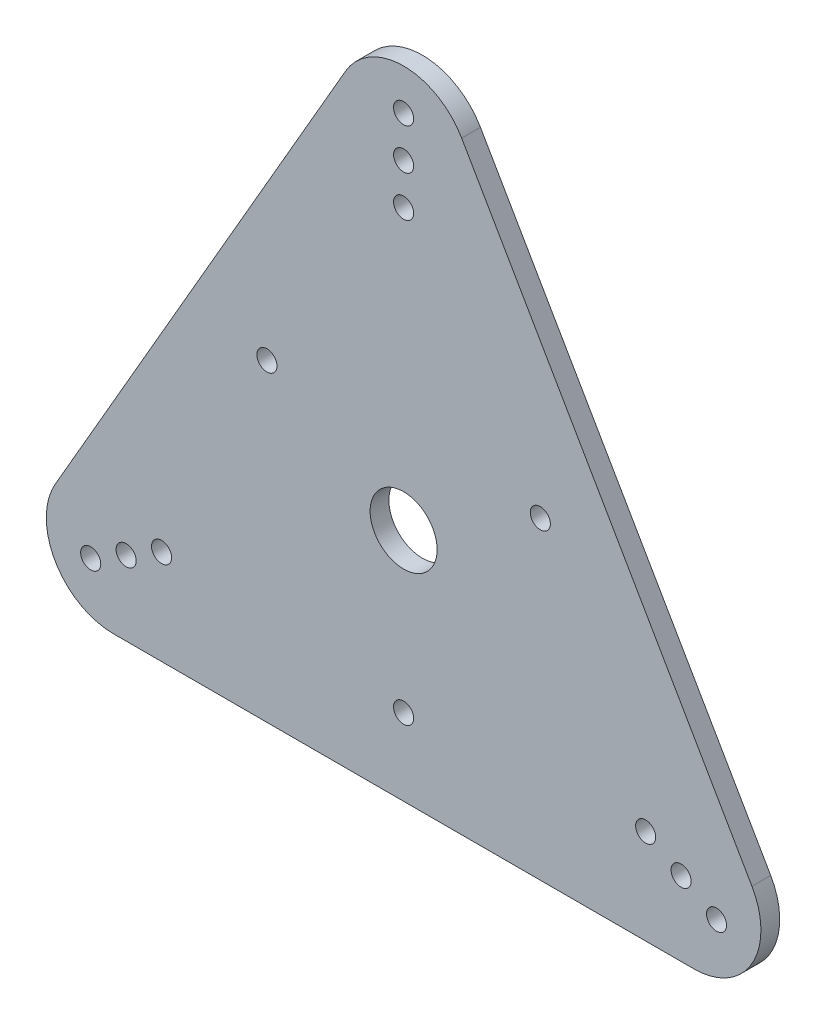
ISO-10303-21;
HEADER;
FILE_DESCRIPTION(('STEP AP214'),'2;1');
FILE_NAME('part.step','',(''),(''),'','','');
FILE_SCHEMA(('AUTOMOTIVE_DESIGN { 1 0 10303 214 1 1 1 1 }'));
ENDSEC;
DATA;
#1=APPLICATION_CONTEXT('core data for automotive mechanical design processes');
#2=APPLICATION_PROTOCOL_DEFINITION('international standard','automotive_design',2000,#1);
#3=PRODUCT_CONTEXT('',#1,'mechanical');
#4=PRODUCT('Part','Part','',(#3));
#5=PRODUCT_RELATED_PRODUCT_CATEGORY('part','',(#4));
#6=PRODUCT_DEFINITION_FORMATION('','',#4);
#7=PRODUCT_DEFINITION_CONTEXT('part definition',#1,'design');
#8=PRODUCT_DEFINITION('design','',#6,#7);
#9=PRODUCT_DEFINITION_SHAPE('','',#8);
#10=(LENGTH_UNIT() NAMED_UNIT(*) SI_UNIT(.MILLI.,.METRE.));
#11=(NAMED_UNIT(*) PLANE_ANGLE_UNIT() SI_UNIT($,.RADIAN.));
#12=(NAMED_UNIT(*) SI_UNIT($,.STERADIAN.) SOLID_ANGLE_UNIT());
#13=UNCERTAINTY_MEASURE_WITH_UNIT(LENGTH_MEASURE(1.E-05),#10,'distance_accuracy_value','');
#14=(GEOMETRIC_REPRESENTATION_CONTEXT(3) GLOBAL_UNCERTAINTY_ASSIGNED_CONTEXT((#13)) GLOBAL_UNIT_ASSIGNED_CONTEXT((#10,
#11,#12)) REPRESENTATION_CONTEXT('',''));
#15=CARTESIAN_POINT('',(0.,0.,0.));
#16=DIRECTION('',(0.,0.,1.));
#17=DIRECTION('',(1.,0.,0.));
#18=AXIS2_PLACEMENT_3D('',#15,#16,#17);
#19=CARTESIAN_POINT('',(-106.844518253204,107.347932616789,2.8));
#20=DIRECTION('',(0.,0.,1.));
#21=DIRECTION('',(1.,0.,0.));
#22=AXIS2_PLACEMENT_3D('',#19,#20,#21);
#23=PLANE('',#22);
#24=CARTESIAN_POINT('',(-27.4364839166996,111.501682616789,2.8));
#25=DIRECTION('',(0.,0.,1.));
#26=DIRECTION('',(1.,0.,0.));
#27=AXIS2_PLACEMENT_3D('',#24,#25,#26);
#28=CIRCLE('',#27,1.5);
#29=CARTESIAN_POINT('',(-25.9364839166996,111.501682616789,2.8));
#30=VERTEX_POINT('',#29);
#31=EDGE_CURVE('E228',#30,#30,#28,.T.);
#32=ORIENTED_EDGE('',*,*,#31,.F.);
#33=EDGE_LOOP('',(#32));
#34=FACE_BOUND('',#33,.T.);
#35=CARTESIAN_POINT('',(-16.8666438635105,105.399182616789,2.8));
#36=DIRECTION('',(0.,0.,1.));
#37=DIRECTION('',(1.,0.,0.));
#38=AXIS2_PLACEMENT_3D('',#35,#36,#37);
#39=CIRCLE('',#38,1.5);
#40=CARTESIAN_POINT('',(-15.3666438635105,105.399182616789,2.8));
#41=VERTEX_POINT('',#40);
#42=EDGE_CURVE('E240',#41,#41,#39,.T.);
#43=ORIENTED_EDGE('',*,*,#42,.F.);
#44=EDGE_LOOP('',(#43));
#45=FACE_BOUND('',#44,.T.);
#46=CARTESIAN_POINT('',(-104.93493223786,108.450432616789,2.8));
#47=DIRECTION('',(0.,0.,1.));
#48=DIRECTION('',(1.,0.,0.));
#49=AXIS2_PLACEMENT_3D('',#46,#47,#48);
#50=CIRCLE('',#49,1.5);
#51=CARTESIAN_POINT('',(-103.43493223786,108.450432616789,2.8));
#52=VERTEX_POINT('',#51);
#53=EDGE_CURVE('E252',#52,#52,#50,.T.);
#54=ORIENTED_EDGE('',*,*,#53,.F.);
#55=EDGE_LOOP('',(#54));
#56=FACE_BOUND('',#55,.T.);
#57=CARTESIAN_POINT('',(-63.5432480639823,174.040432616789,2.8));
#58=DIRECTION('',(0.,0.,1.));
#59=DIRECTION('',(1.,0.,0.));
#60=AXIS2_PLACEMENT_3D('',#57,#58,#59);
#61=CIRCLE('',#60,1.5);
#62=CARTESIAN_POINT('',(-62.0432480639823,174.040432616789,2.8));
#63=VERTEX_POINT('',#62);
#64=EDGE_CURVE('E264',#63,#63,#61,.T.);
#65=ORIENTED_EDGE('',*,*,#64,.F.);
#66=EDGE_LOOP('',(#65));
#67=FACE_BOUND('',#66,.T.);
#68=CARTESIAN_POINT('',(-63.5432480639823,186.245432616789,2.8));
#69=DIRECTION('',(0.,0.,1.));
#70=DIRECTION('',(1.,0.,0.));
#71=AXIS2_PLACEMENT_3D('',#68,#69,#70);
#72=CIRCLE('',#71,1.5);
#73=CARTESIAN_POINT('',(-62.0432480639823,186.245432616789,2.8));
#74=VERTEX_POINT('',#73);
#75=EDGE_CURVE('E276',#74,#74,#72,.T.);
#76=ORIENTED_EDGE('',*,*,#75,.F.);
#77=EDGE_LOOP('',(#76));
#78=FACE_BOUND('',#77,.T.);
#79=CARTESIAN_POINT('',(-43.1526799318777,144.120432616789,2.8));
#80=DIRECTION('',(0.,0.,1.));
#81=DIRECTION('',(1.,0.,0.));
#82=AXIS2_PLACEMENT_3D('',#79,#80,#81);
#83=CIRCLE('',#82,1.5);
#84=CARTESIAN_POINT('',(-41.6526799318777,144.120432616789,2.8));
#85=VERTEX_POINT('',#84);
#86=EDGE_CURVE('E288',#85,#85,#83,.T.);
#87=ORIENTED_EDGE('',*,*,#86,.F.);
#88=EDGE_LOOP('',(#87));
#89=FACE_BOUND('',#88,.T.);
#90=CARTESIAN_POINT('',(-106.844518253204,107.347932616789,2.8));
#91=DIRECTION('',(0.,0.,1.));
#92=DIRECTION('',(1.,0.,0.));
#93=AXIS2_PLACEMENT_3D('',#90,#91,#92);
#94=CIRCLE('',#93,9.99999999999999);
#95=CARTESIAN_POINT('',(-115.504772291049,112.347932616789,2.8));
#96=VERTEX_POINT('',#95);
#97=CARTESIAN_POINT('',(-106.844518253204,97.3479326167893,2.8));
#98=VERTEX_POINT('',#97);
#99=EDGE_CURVE('E132',#96,#98,#94,.T.);
#100=ORIENTED_EDGE('',*,*,#99,.T.);
#101=DIRECTION('',(1.,0.,0.));
#102=VECTOR('',#101,1.);
#103=CARTESIAN_POINT('',(-106.844518253204,97.3479326167893,2.8));
#104=LINE('',#103,#102);
#105=CARTESIAN_POINT('',(-20.2419778747603,97.3479326167892,2.8));
#106=VERTEX_POINT('',#105);
#107=EDGE_CURVE('E90',#98,#106,#104,.T.);
#108=ORIENTED_EDGE('',*,*,#107,.T.);
#109=CARTESIAN_POINT('',(-20.2419778747603,107.347932616789,2.8));
#110=DIRECTION('',(0.,0.,1.));
#111=DIRECTION('',(1.,0.,0.));
#112=AXIS2_PLACEMENT_3D('',#109,#110,#111);
#113=CIRCLE('',#112,9.99999999999999);
#114=CARTESIAN_POINT('',(-11.5817238369159,112.347932616789,2.8));
#115=VERTEX_POINT('',#114);
#116=EDGE_CURVE('E103',#106,#115,#113,.T.);
#117=ORIENTED_EDGE('',*,*,#116,.T.);
#118=DIRECTION('',(-0.5,0.866025403784439,0.));
#119=VECTOR('',#118,1.);
#120=CARTESIAN_POINT('',(-11.5817238369159,112.347932616789,2.8));
#121=LINE('',#120,#119);
#122=CARTESIAN_POINT('',(-54.8829940261379,187.347932616789,2.8));
#123=VERTEX_POINT('',#122);
#124=EDGE_CURVE('E97',#115,#123,#121,.T.);
#125=ORIENTED_EDGE('',*,*,#124,.T.);
#126=CARTESIAN_POINT('',(-63.5432480639823,182.347932616789,2.8));
#127=DIRECTION('',(0.,0.,1.));
#128=DIRECTION('',(1.,0.,0.));
#129=AXIS2_PLACEMENT_3D('',#126,#127,#128);
#130=CIRCLE('',#129,9.99999999999999);
#131=CARTESIAN_POINT('',(-72.2035021018266,187.347932616789,2.8));
#132=VERTEX_POINT('',#131);
#133=EDGE_CURVE('E101',#123,#132,#130,.T.);
#134=ORIENTED_EDGE('',*,*,#133,.T.);
#135=DIRECTION('',(-0.5,-0.866025403784439,0.));
#136=VECTOR('',#135,1.);
#137=CARTESIAN_POINT('',(-72.2035021018266,187.347932616789,2.8));
#138=LINE('',#137,#136);
#139=EDGE_CURVE('E53',#132,#96,#138,.T.);
#140=ORIENTED_EDGE('',*,*,#139,.T.);
#141=EDGE_LOOP('',(#100,#108,#117,#125,#134,#140));
#142=FACE_BOUND('',#141,.T.);
#143=CARTESIAN_POINT('',(-63.5432480639823,108.802932616789,2.8));
#144=DIRECTION('',(0.,0.,1.));
#145=DIRECTION('',(1.,0.,0.));
#146=AXIS2_PLACEMENT_3D('',#143,#144,#145);
#147=CIRCLE('',#146,1.5);
#148=CARTESIAN_POINT('',(-62.0432480639823,108.802932616789,2.8));
#149=VERTEX_POINT('',#148);
#150=EDGE_CURVE('E125',#149,#149,#147,.T.);
#151=ORIENTED_EDGE('',*,*,#150,.F.);
#152=EDGE_LOOP('',(#151));
#153=FACE_BOUND('',#152,.T.);
#154=CARTESIAN_POINT('',(-83.9338161960869,144.120432616789,2.8));
#155=DIRECTION('',(0.,0.,1.));
#156=DIRECTION('',(1.,0.,0.));
#157=AXIS2_PLACEMENT_3D('',#154,#155,#156);
#158=CIRCLE('',#157,1.5);
#159=CARTESIAN_POINT('',(-82.4338161960869,144.120432616789,2.8));
#160=VERTEX_POINT('',#159);
#161=EDGE_CURVE('E282',#160,#160,#158,.T.);
#162=ORIENTED_EDGE('',*,*,#161,.F.);
#163=EDGE_LOOP('',(#162));
#164=FACE_BOUND('',#163,.T.);
#165=CARTESIAN_POINT('',(-63.5432480639823,180.142932616789,2.8));
#166=DIRECTION('',(0.,0.,1.));
#167=DIRECTION('',(1.,0.,0.));
#168=AXIS2_PLACEMENT_3D('',#165,#166,#167);
#169=CIRCLE('',#168,1.5);
#170=CARTESIAN_POINT('',(-62.0432480639823,180.142932616789,2.8));
#171=VERTEX_POINT('',#170);
#172=EDGE_CURVE('E270',#171,#171,#169,.T.);
#173=ORIENTED_EDGE('',*,*,#172,.F.);
#174=EDGE_LOOP('',(#173));
#175=FACE_BOUND('',#174,.T.);
#176=CARTESIAN_POINT('',(-110.219852264454,105.399182616789,2.8));
#177=DIRECTION('',(0.,0.,1.));
#178=DIRECTION('',(1.,0.,0.));
#179=AXIS2_PLACEMENT_3D('',#176,#177,#178);
#180=CIRCLE('',#179,1.5);
#181=CARTESIAN_POINT('',(-108.719852264454,105.399182616789,2.8));
#182=VERTEX_POINT('',#181);
#183=EDGE_CURVE('E258',#182,#182,#180,.T.);
#184=ORIENTED_EDGE('',*,*,#183,.F.);
#185=EDGE_LOOP('',(#184));
#186=FACE_BOUND('',#185,.T.);
#187=CARTESIAN_POINT('',(-99.650012211265,111.501682616789,2.8));
#188=DIRECTION('',(0.,0.,1.));
#189=DIRECTION('',(1.,0.,0.));
#190=AXIS2_PLACEMENT_3D('',#187,#188,#189);
#191=CIRCLE('',#190,1.5);
#192=CARTESIAN_POINT('',(-98.150012211265,111.501682616789,2.8));
#193=VERTEX_POINT('',#192);
#194=EDGE_CURVE('E246',#193,#193,#191,.T.);
#195=ORIENTED_EDGE('',*,*,#194,.F.);
#196=EDGE_LOOP('',(#195));
#197=FACE_BOUND('',#196,.T.);
#198=CARTESIAN_POINT('',(-22.151563890105,108.450432616789,2.8));
#199=DIRECTION('',(0.,0.,1.));
#200=DIRECTION('',(1.,0.,0.));
#201=AXIS2_PLACEMENT_3D('',#198,#199,#200);
#202=CIRCLE('',#201,1.5);
#203=CARTESIAN_POINT('',(-20.651563890105,108.450432616789,2.8));
#204=VERTEX_POINT('',#203);
#205=EDGE_CURVE('E234',#204,#204,#202,.T.);
#206=ORIENTED_EDGE('',*,*,#205,.F.);
#207=EDGE_LOOP('',(#206));
#208=FACE_BOUND('',#207,.T.);
#209=CARTESIAN_POINT('',(-63.5432480639823,132.347932616789,2.8));
#210=DIRECTION('',(0.,0.,1.));
#211=DIRECTION('',(1.,0.,0.));
#212=AXIS2_PLACEMENT_3D('',#209,#210,#211);
#213=CIRCLE('',#212,5.);
#214=CARTESIAN_POINT('',(-58.5432480639823,132.347932616789,2.8));
#215=VERTEX_POINT('',#214);
#216=EDGE_CURVE('E219',#215,#215,#213,.T.);
#217=ORIENTED_EDGE('',*,*,#216,.F.);
#218=EDGE_LOOP('',(#217));
#219=FACE_BOUND('',#218,.T.);
#220=ADVANCED_FACE('F36',(#34,#45,#56,#67,#78,#89,#142,#153,#164,#175,#186,#197,#208,#219),#23,.T.);
#221=CARTESIAN_POINT('',(-106.844518253204,107.347932616789,0.));
#222=DIRECTION('',(0.,0.,1.));
#223=DIRECTION('',(1.,0.,0.));
#224=AXIS2_PLACEMENT_3D('',#221,#222,#223);
#225=PLANE('',#224);
#226=CARTESIAN_POINT('',(-106.844518253204,107.347932616789,0.));
#227=DIRECTION('',(0.,0.,1.));
#228=DIRECTION('',(1.,0.,0.));
#229=AXIS2_PLACEMENT_3D('',#226,#227,#228);
#230=CIRCLE('',#229,9.99999999999999);
#231=CARTESIAN_POINT('',(-115.504772291049,112.347932616789,0.));
#232=VERTEX_POINT('',#231);
#233=CARTESIAN_POINT('',(-106.844518253204,97.3479326167893,0.));
#234=VERTEX_POINT('',#233);
#235=EDGE_CURVE('E121',#232,#234,#230,.T.);
#236=ORIENTED_EDGE('',*,*,#235,.F.);
#237=DIRECTION('',(-0.5,-0.866025403784439,0.));
#238=VECTOR('',#237,1.);
#239=CARTESIAN_POINT('',(-72.2035021018266,187.347932616789,0.));
#240=LINE('',#239,#238);
#241=CARTESIAN_POINT('',(-72.2035021018266,187.347932616789,0.));
#242=VERTEX_POINT('',#241);
#243=EDGE_CURVE('E82',#242,#232,#240,.T.);
#244=ORIENTED_EDGE('',*,*,#243,.F.);
#245=CARTESIAN_POINT('',(-63.5432480639823,182.347932616789,0.));
#246=DIRECTION('',(0.,0.,1.));
#247=DIRECTION('',(1.,0.,0.));
#248=AXIS2_PLACEMENT_3D('',#245,#246,#247);
#249=CIRCLE('',#248,9.99999999999999);
#250=CARTESIAN_POINT('',(-54.8829940261379,187.347932616789,0.));
#251=VERTEX_POINT('',#250);
#252=EDGE_CURVE('E76',#251,#242,#249,.T.);
#253=ORIENTED_EDGE('',*,*,#252,.F.);
#254=DIRECTION('',(-0.5,0.866025403784439,0.));
#255=VECTOR('',#254,1.);
#256=CARTESIAN_POINT('',(-11.5817238369159,112.347932616789,0.));
#257=LINE('',#256,#255);
#258=CARTESIAN_POINT('',(-11.5817238369159,112.347932616789,0.));
#259=VERTEX_POINT('',#258);
#260=EDGE_CURVE('E111',#259,#251,#257,.T.);
#261=ORIENTED_EDGE('',*,*,#260,.F.);
#262=CARTESIAN_POINT('',(-20.2419778747603,107.347932616789,0.));
#263=DIRECTION('',(0.,0.,1.));
#264=DIRECTION('',(1.,0.,0.));
#265=AXIS2_PLACEMENT_3D('',#262,#263,#264);
#266=CIRCLE('',#265,9.99999999999999);
#267=CARTESIAN_POINT('',(-20.2419778747603,97.3479326167892,0.));
#268=VERTEX_POINT('',#267);
#269=EDGE_CURVE('E127',#268,#259,#266,.T.);
#270=ORIENTED_EDGE('',*,*,#269,.F.);
#271=DIRECTION('',(1.,0.,0.));
#272=VECTOR('',#271,1.);
#273=CARTESIAN_POINT('',(-106.844518253204,97.3479326167893,0.));
#274=LINE('',#273,#272);
#275=EDGE_CURVE('E124',#234,#268,#274,.T.);
#276=ORIENTED_EDGE('',*,*,#275,.F.);
#277=EDGE_LOOP('',(#236,#244,#253,#261,#270,#276));
#278=FACE_BOUND('',#277,.T.);
#279=CARTESIAN_POINT('',(-63.5432480639823,108.802932616789,0.));
#280=DIRECTION('',(0.,0.,1.));
#281=DIRECTION('',(1.,0.,0.));
#282=AXIS2_PLACEMENT_3D('',#279,#280,#281);
#283=CIRCLE('',#282,1.5);
#284=CARTESIAN_POINT('',(-62.0432480639823,108.802932616789,0.));
#285=VERTEX_POINT('',#284);
#286=EDGE_CURVE('E291',#285,#285,#283,.T.);
#287=ORIENTED_EDGE('',*,*,#286,.T.);
#288=EDGE_LOOP('',(#287));
#289=FACE_BOUND('',#288,.T.);
#290=CARTESIAN_POINT('',(-43.1526799318777,144.120432616789,0.));
#291=DIRECTION('',(0.,0.,1.));
#292=DIRECTION('',(1.,0.,0.));
#293=AXIS2_PLACEMENT_3D('',#290,#291,#292);
#294=CIRCLE('',#293,1.5);
#295=CARTESIAN_POINT('',(-41.6526799318777,144.120432616789,0.));
#296=VERTEX_POINT('',#295);
#297=EDGE_CURVE('E285',#296,#296,#294,.T.);
#298=ORIENTED_EDGE('',*,*,#297,.T.);
#299=EDGE_LOOP('',(#298));
#300=FACE_BOUND('',#299,.T.);
#301=CARTESIAN_POINT('',(-83.9338161960869,144.120432616789,0.));
#302=DIRECTION('',(0.,0.,1.));
#303=DIRECTION('',(1.,0.,0.));
#304=AXIS2_PLACEMENT_3D('',#301,#302,#303);
#305=CIRCLE('',#304,1.5);
#306=CARTESIAN_POINT('',(-82.4338161960869,144.120432616789,0.));
#307=VERTEX_POINT('',#306);
#308=EDGE_CURVE('E279',#307,#307,#305,.T.);
#309=ORIENTED_EDGE('',*,*,#308,.T.);
#310=EDGE_LOOP('',(#309));
#311=FACE_BOUND('',#310,.T.);
#312=CARTESIAN_POINT('',(-63.5432480639823,186.245432616789,0.));
#313=DIRECTION('',(0.,0.,1.));
#314=DIRECTION('',(1.,0.,0.));
#315=AXIS2_PLACEMENT_3D('',#312,#313,#314);
#316=CIRCLE('',#315,1.5);
#317=CARTESIAN_POINT('',(-62.0432480639823,186.245432616789,0.));
#318=VERTEX_POINT('',#317);
#319=EDGE_CURVE('E273',#318,#318,#316,.T.);
#320=ORIENTED_EDGE('',*,*,#319,.T.);
#321=EDGE_LOOP('',(#320));
#322=FACE_BOUND('',#321,.T.);
#323=CARTESIAN_POINT('',(-63.5432480639823,180.142932616789,0.));
#324=DIRECTION('',(0.,0.,1.));
#325=DIRECTION('',(1.,0.,0.));
#326=AXIS2_PLACEMENT_3D('',#323,#324,#325);
#327=CIRCLE('',#326,1.5);
#328=CARTESIAN_POINT('',(-62.0432480639823,180.142932616789,0.));
#329=VERTEX_POINT('',#328);
#330=EDGE_CURVE('E267',#329,#329,#327,.T.);
#331=ORIENTED_EDGE('',*,*,#330,.T.);
#332=EDGE_LOOP('',(#331));
#333=FACE_BOUND('',#332,.T.);
#334=CARTESIAN_POINT('',(-63.5432480639823,174.040432616789,0.));
#335=DIRECTION('',(0.,0.,1.));
#336=DIRECTION('',(1.,0.,0.));
#337=AXIS2_PLACEMENT_3D('',#334,#335,#336);
#338=CIRCLE('',#337,1.5);
#339=CARTESIAN_POINT('',(-62.0432480639823,174.040432616789,0.));
#340=VERTEX_POINT('',#339);
#341=EDGE_CURVE('E261',#340,#340,#338,.T.);
#342=ORIENTED_EDGE('',*,*,#341,.T.);
#343=EDGE_LOOP('',(#342));
#344=FACE_BOUND('',#343,.T.);
#345=CARTESIAN_POINT('',(-110.219852264454,105.399182616789,0.));
#346=DIRECTION('',(0.,0.,1.));
#347=DIRECTION('',(1.,0.,0.));
#348=AXIS2_PLACEMENT_3D('',#345,#346,#347);
#349=CIRCLE('',#348,1.5);
#350=CARTESIAN_POINT('',(-108.719852264454,105.399182616789,0.));
#351=VERTEX_POINT('',#350);
#352=EDGE_CURVE('E255',#351,#351,#349,.T.);
#353=ORIENTED_EDGE('',*,*,#352,.T.);
#354=EDGE_LOOP('',(#353));
#355=FACE_BOUND('',#354,.T.);
#356=CARTESIAN_POINT('',(-104.93493223786,108.450432616789,0.));
#357=DIRECTION('',(0.,0.,1.));
#358=DIRECTION('',(1.,0.,0.));
#359=AXIS2_PLACEMENT_3D('',#356,#357,#358);
#360=CIRCLE('',#359,1.5);
#361=CARTESIAN_POINT('',(-103.43493223786,108.450432616789,0.));
#362=VERTEX_POINT('',#361);
#363=EDGE_CURVE('E249',#362,#362,#360,.T.);
#364=ORIENTED_EDGE('',*,*,#363,.T.);
#365=EDGE_LOOP('',(#364));
#366=FACE_BOUND('',#365,.T.);
#367=CARTESIAN_POINT('',(-99.650012211265,111.501682616789,0.));
#368=DIRECTION('',(0.,0.,1.));
#369=DIRECTION('',(1.,0.,0.));
#370=AXIS2_PLACEMENT_3D('',#367,#368,#369);
#371=CIRCLE('',#370,1.5);
#372=CARTESIAN_POINT('',(-98.150012211265,111.501682616789,0.));
#373=VERTEX_POINT('',#372);
#374=EDGE_CURVE('E243',#373,#373,#371,.T.);
#375=ORIENTED_EDGE('',*,*,#374,.T.);
#376=EDGE_LOOP('',(#375));
#377=FACE_BOUND('',#376,.T.);
#378=CARTESIAN_POINT('',(-16.8666438635105,105.399182616789,0.));
#379=DIRECTION('',(0.,0.,1.));
#380=DIRECTION('',(1.,0.,0.));
#381=AXIS2_PLACEMENT_3D('',#378,#379,#380);
#382=CIRCLE('',#381,1.5);
#383=CARTESIAN_POINT('',(-15.3666438635105,105.399182616789,0.));
#384=VERTEX_POINT('',#383);
#385=EDGE_CURVE('E237',#384,#384,#382,.T.);
#386=ORIENTED_EDGE('',*,*,#385,.T.);
#387=EDGE_LOOP('',(#386));
#388=FACE_BOUND('',#387,.T.);
#389=CARTESIAN_POINT('',(-22.151563890105,108.450432616789,0.));
#390=DIRECTION('',(0.,0.,1.));
#391=DIRECTION('',(1.,0.,0.));
#392=AXIS2_PLACEMENT_3D('',#389,#390,#391);
#393=CIRCLE('',#392,1.5);
#394=CARTESIAN_POINT('',(-20.651563890105,108.450432616789,0.));
#395=VERTEX_POINT('',#394);
#396=EDGE_CURVE('E231',#395,#395,#393,.T.);
#397=ORIENTED_EDGE('',*,*,#396,.T.);
#398=EDGE_LOOP('',(#397));
#399=FACE_BOUND('',#398,.T.);
#400=CARTESIAN_POINT('',(-27.4364839166996,111.501682616789,0.));
#401=DIRECTION('',(0.,0.,1.));
#402=DIRECTION('',(1.,0.,0.));
#403=AXIS2_PLACEMENT_3D('',#400,#401,#402);
#404=CIRCLE('',#403,1.5);
#405=CARTESIAN_POINT('',(-25.9364839166996,111.501682616789,0.));
#406=VERTEX_POINT('',#405);
#407=EDGE_CURVE('E225',#406,#406,#404,.T.);
#408=ORIENTED_EDGE('',*,*,#407,.T.);
#409=EDGE_LOOP('',(#408));
#410=FACE_BOUND('',#409,.T.);
#411=CARTESIAN_POINT('',(-63.5432480639823,132.347932616789,0.));
#412=DIRECTION('',(0.,0.,1.));
#413=DIRECTION('',(1.,0.,0.));
#414=AXIS2_PLACEMENT_3D('',#411,#412,#413);
#415=CIRCLE('',#414,5.);
#416=CARTESIAN_POINT('',(-58.5432480639823,132.347932616789,0.));
#417=VERTEX_POINT('',#416);
#418=EDGE_CURVE('E222',#417,#417,#415,.T.);
#419=ORIENTED_EDGE('',*,*,#418,.T.);
#420=EDGE_LOOP('',(#419));
#421=FACE_BOUND('',#420,.T.);
#422=ADVANCED_FACE('F141',(#278,#289,#300,#311,#322,#333,#344,#355,#366,#377,#388,#399,#410,
#421),#225,.F.);
#423=CARTESIAN_POINT('',(-106.844518253204,107.347932616789,2.8));
#424=DIRECTION('',(0.,0.,-1.));
#425=DIRECTION('',(-1.,0.,0.));
#426=AXIS2_PLACEMENT_3D('',#423,#424,#425);
#427=CYLINDRICAL_SURFACE('',#426,9.99999999999999);
#428=ORIENTED_EDGE('',*,*,#235,.T.);
#429=DIRECTION('',(0.,0.,-1.));
#430=VECTOR('',#429,1.);
#431=CARTESIAN_POINT('',(-106.844518253204,97.3479326167893,2.8));
#432=LINE('',#431,#430);
#433=EDGE_CURVE('E11',#98,#234,#432,.T.);
#434=ORIENTED_EDGE('',*,*,#433,.F.);
#435=ORIENTED_EDGE('',*,*,#99,.F.);
#436=DIRECTION('',(0.,0.,-1.));
#437=VECTOR('',#436,1.);
#438=CARTESIAN_POINT('',(-115.504772291049,112.347932616789,2.8));
#439=LINE('',#438,#437);
#440=EDGE_CURVE('E117',#96,#232,#439,.T.);
#441=ORIENTED_EDGE('',*,*,#440,.T.);
#442=EDGE_LOOP('',(#428,#434,#435,#441));
#443=FACE_BOUND('',#442,.T.);
#444=ADVANCED_FACE('F38',(#443),#427,.T.);
#445=CARTESIAN_POINT('',(-106.844518253204,97.3479326167893,2.8));
#446=DIRECTION('',(0.,1.,0.));
#447=DIRECTION('',(-1.,0.,0.));
#448=AXIS2_PLACEMENT_3D('',#445,#446,#447);
#449=PLANE('',#448);
#450=ORIENTED_EDGE('',*,*,#275,.T.);
#451=DIRECTION('',(0.,0.,-1.));
#452=VECTOR('',#451,1.);
#453=CARTESIAN_POINT('',(-20.2419778747603,97.3479326167892,2.8));
#454=LINE('',#453,#452);
#455=EDGE_CURVE('E45',#106,#268,#454,.T.);
#456=ORIENTED_EDGE('',*,*,#455,.F.);
#457=ORIENTED_EDGE('',*,*,#107,.F.);
#458=ORIENTED_EDGE('',*,*,#433,.T.);
#459=EDGE_LOOP('',(#450,#456,#457,#458));
#460=FACE_BOUND('',#459,.T.);
#461=ADVANCED_FACE('F444',(#460),#449,.F.);
#462=CARTESIAN_POINT('',(-20.2419778747603,107.347932616789,2.8));
#463=DIRECTION('',(0.,0.,-1.));
#464=DIRECTION('',(-1.,0.,0.));
#465=AXIS2_PLACEMENT_3D('',#462,#463,#464);
#466=CYLINDRICAL_SURFACE('',#465,9.99999999999999);
#467=ORIENTED_EDGE('',*,*,#269,.T.);
#468=DIRECTION('',(0.,0.,-1.));
#469=VECTOR('',#468,1.);
#470=CARTESIAN_POINT('',(-11.5817238369159,112.347932616789,2.8));
#471=LINE('',#470,#469);
#472=EDGE_CURVE('E112',#115,#259,#471,.T.);
#473=ORIENTED_EDGE('',*,*,#472,.F.);
#474=ORIENTED_EDGE('',*,*,#116,.F.);
#475=ORIENTED_EDGE('',*,*,#455,.T.);
#476=EDGE_LOOP('',(#467,#473,#474,#475));
#477=FACE_BOUND('',#476,.T.);
#478=ADVANCED_FACE('F138',(#477),#466,.T.);
#479=CARTESIAN_POINT('',(-11.5817238369159,112.347932616789,2.8));
#480=DIRECTION('',(-0.866025403784439,-0.5,0.));
#481=DIRECTION('',(0.5,-0.866025403784439,0.));
#482=AXIS2_PLACEMENT_3D('',#479,#480,#481);
#483=PLANE('',#482);
#484=ORIENTED_EDGE('',*,*,#260,.T.);
#485=DIRECTION('',(0.,0.,-1.));
#486=VECTOR('',#485,1.);
#487=CARTESIAN_POINT('',(-54.8829940261379,187.347932616789,2.8));
#488=LINE('',#487,#486);
#489=EDGE_CURVE('E108',#123,#251,#488,.T.);
#490=ORIENTED_EDGE('',*,*,#489,.F.);
#491=ORIENTED_EDGE('',*,*,#124,.F.);
#492=ORIENTED_EDGE('',*,*,#472,.T.);
#493=EDGE_LOOP('',(#484,#490,#491,#492));
#494=FACE_BOUND('',#493,.T.);
#495=ADVANCED_FACE('F109',(#494),#483,.F.);
#496=CARTESIAN_POINT('',(-63.5432480639823,182.347932616789,2.8));
#497=DIRECTION('',(0.,0.,-1.));
#498=DIRECTION('',(-1.,0.,0.));
#499=AXIS2_PLACEMENT_3D('',#496,#497,#498);
#500=CYLINDRICAL_SURFACE('',#499,9.99999999999999);
#501=ORIENTED_EDGE('',*,*,#252,.T.);
#502=DIRECTION('',(0.,0.,-1.));
#503=VECTOR('',#502,1.);
#504=CARTESIAN_POINT('',(-72.2035021018266,187.347932616789,2.8));
#505=LINE('',#504,#503);
#506=EDGE_CURVE('E113',#132,#242,#505,.T.);
#507=ORIENTED_EDGE('',*,*,#506,.F.);
#508=ORIENTED_EDGE('',*,*,#133,.F.);
#509=ORIENTED_EDGE('',*,*,#489,.T.);
#510=EDGE_LOOP('',(#501,#507,#508,#509));
#511=FACE_BOUND('',#510,.T.);
#512=ADVANCED_FACE('F115',(#511),#500,.T.);
#513=CARTESIAN_POINT('',(-72.2035021018266,187.347932616789,2.8));
#514=DIRECTION('',(0.866025403784439,-0.5,0.));
#515=DIRECTION('',(0.5,0.866025403784439,0.));
#516=AXIS2_PLACEMENT_3D('',#513,#514,#515);
#517=PLANE('',#516);
#518=ORIENTED_EDGE('',*,*,#243,.T.);
#519=ORIENTED_EDGE('',*,*,#440,.F.);
#520=ORIENTED_EDGE('',*,*,#139,.F.);
#521=ORIENTED_EDGE('',*,*,#506,.T.);
#522=EDGE_LOOP('',(#518,#519,#520,#521));
#523=FACE_BOUND('',#522,.T.);
#524=ADVANCED_FACE('F146',(#523),#517,.F.);
#525=CARTESIAN_POINT('',(-63.5432480639823,108.802932616789,2.8));
#526=DIRECTION('',(0.,0.,-1.));
#527=DIRECTION('',(-1.,0.,0.));
#528=AXIS2_PLACEMENT_3D('',#525,#526,#527);
#529=CYLINDRICAL_SURFACE('',#528,1.5);
#530=ORIENTED_EDGE('',*,*,#150,.T.);
#531=EDGE_LOOP('',(#530));
#532=FACE_BOUND('',#531,.T.);
#533=ORIENTED_EDGE('',*,*,#286,.F.);
#534=EDGE_LOOP('',(#533));
#535=FACE_BOUND('',#534,.T.);
#536=ADVANCED_FACE('F148',(#532,#535),#529,.F.);
#537=CARTESIAN_POINT('',(-43.1526799318777,144.120432616789,2.8));
#538=DIRECTION('',(0.,0.,-1.));
#539=DIRECTION('',(-1.,0.,0.));
#540=AXIS2_PLACEMENT_3D('',#537,#538,#539);
#541=CYLINDRICAL_SURFACE('',#540,1.5);
#542=ORIENTED_EDGE('',*,*,#86,.T.);
#543=EDGE_LOOP('',(#542));
#544=FACE_BOUND('',#543,.T.);
#545=ORIENTED_EDGE('',*,*,#297,.F.);
#546=EDGE_LOOP('',(#545));
#547=FACE_BOUND('',#546,.T.);
#548=ADVANCED_FACE('F154',(#544,#547),#541,.F.);
#549=CARTESIAN_POINT('',(-83.9338161960869,144.120432616789,2.8));
#550=DIRECTION('',(0.,0.,-1.));
#551=DIRECTION('',(-1.,0.,0.));
#552=AXIS2_PLACEMENT_3D('',#549,#550,#551);
#553=CYLINDRICAL_SURFACE('',#552,1.5);
#554=ORIENTED_EDGE('',*,*,#161,.T.);
#555=EDGE_LOOP('',(#554));
#556=FACE_BOUND('',#555,.T.);
#557=ORIENTED_EDGE('',*,*,#308,.F.);
#558=EDGE_LOOP('',(#557));
#559=FACE_BOUND('',#558,.T.);
#560=ADVANCED_FACE('F170',(#556,#559),#553,.F.);
#561=CARTESIAN_POINT('',(-63.5432480639823,186.245432616789,2.8));
#562=DIRECTION('',(0.,0.,-1.));
#563=DIRECTION('',(-1.,0.,0.));
#564=AXIS2_PLACEMENT_3D('',#561,#562,#563);
#565=CYLINDRICAL_SURFACE('',#564,1.5);
#566=ORIENTED_EDGE('',*,*,#75,.T.);
#567=EDGE_LOOP('',(#566));
#568=FACE_BOUND('',#567,.T.);
#569=ORIENTED_EDGE('',*,*,#319,.F.);
#570=EDGE_LOOP('',(#569));
#571=FACE_BOUND('',#570,.T.);
#572=ADVANCED_FACE('F174',(#568,#571),#565,.F.);
#573=CARTESIAN_POINT('',(-63.5432480639823,180.142932616789,2.8));
#574=DIRECTION('',(0.,0.,-1.));
#575=DIRECTION('',(-1.,0.,0.));
#576=AXIS2_PLACEMENT_3D('',#573,#574,#575);
#577=CYLINDRICAL_SURFACE('',#576,1.5);
#578=ORIENTED_EDGE('',*,*,#172,.T.);
#579=EDGE_LOOP('',(#578));
#580=FACE_BOUND('',#579,.T.);
#581=ORIENTED_EDGE('',*,*,#330,.F.);
#582=EDGE_LOOP('',(#581));
#583=FACE_BOUND('',#582,.T.);
#584=ADVANCED_FACE('F178',(#580,#583),#577,.F.);
#585=CARTESIAN_POINT('',(-63.5432480639823,174.040432616789,2.8));
#586=DIRECTION('',(0.,0.,-1.));
#587=DIRECTION('',(-1.,0.,0.));
#588=AXIS2_PLACEMENT_3D('',#585,#586,#587);
#589=CYLINDRICAL_SURFACE('',#588,1.5);
#590=ORIENTED_EDGE('',*,*,#64,.T.);
#591=EDGE_LOOP('',(#590));
#592=FACE_BOUND('',#591,.T.);
#593=ORIENTED_EDGE('',*,*,#341,.F.);
#594=EDGE_LOOP('',(#593));
#595=FACE_BOUND('',#594,.T.);
#596=ADVANCED_FACE('F182',(#592,#595),#589,.F.);
#597=CARTESIAN_POINT('',(-110.219852264454,105.399182616789,2.8));
#598=DIRECTION('',(0.,0.,-1.));
#599=DIRECTION('',(-1.,0.,0.));
#600=AXIS2_PLACEMENT_3D('',#597,#598,#599);
#601=CYLINDRICAL_SURFACE('',#600,1.5);
#602=ORIENTED_EDGE('',*,*,#183,.T.);
#603=EDGE_LOOP('',(#602));
#604=FACE_BOUND('',#603,.T.);
#605=ORIENTED_EDGE('',*,*,#352,.F.);
#606=EDGE_LOOP('',(#605));
#607=FACE_BOUND('',#606,.T.);
#608=ADVANCED_FACE('F186',(#604,#607),#601,.F.);
#609=CARTESIAN_POINT('',(-104.93493223786,108.450432616789,2.8));
#610=DIRECTION('',(0.,0.,-1.));
#611=DIRECTION('',(-1.,0.,0.));
#612=AXIS2_PLACEMENT_3D('',#609,#610,#611);
#613=CYLINDRICAL_SURFACE('',#612,1.5);
#614=ORIENTED_EDGE('',*,*,#53,.T.);
#615=EDGE_LOOP('',(#614));
#616=FACE_BOUND('',#615,.T.);
#617=ORIENTED_EDGE('',*,*,#363,.F.);
#618=EDGE_LOOP('',(#617));
#619=FACE_BOUND('',#618,.T.);
#620=ADVANCED_FACE('F190',(#616,#619),#613,.F.);
#621=CARTESIAN_POINT('',(-99.650012211265,111.501682616789,2.8));
#622=DIRECTION('',(0.,0.,-1.));
#623=DIRECTION('',(-1.,0.,0.));
#624=AXIS2_PLACEMENT_3D('',#621,#622,#623);
#625=CYLINDRICAL_SURFACE('',#624,1.5);
#626=ORIENTED_EDGE('',*,*,#194,.T.);
#627=EDGE_LOOP('',(#626));
#628=FACE_BOUND('',#627,.T.);
#629=ORIENTED_EDGE('',*,*,#374,.F.);
#630=EDGE_LOOP('',(#629));
#631=FACE_BOUND('',#630,.T.);
#632=ADVANCED_FACE('F194',(#628,#631),#625,.F.);
#633=CARTESIAN_POINT('',(-16.8666438635105,105.399182616789,2.8));
#634=DIRECTION('',(0.,0.,-1.));
#635=DIRECTION('',(-1.,0.,0.));
#636=AXIS2_PLACEMENT_3D('',#633,#634,#635);
#637=CYLINDRICAL_SURFACE('',#636,1.5);
#638=ORIENTED_EDGE('',*,*,#42,.T.);
#639=EDGE_LOOP('',(#638));
#640=FACE_BOUND('',#639,.T.);
#641=ORIENTED_EDGE('',*,*,#385,.F.);
#642=EDGE_LOOP('',(#641));
#643=FACE_BOUND('',#642,.T.);
#644=ADVANCED_FACE('F198',(#640,#643),#637,.F.);
#645=CARTESIAN_POINT('',(-22.151563890105,108.450432616789,2.8));
#646=DIRECTION('',(0.,0.,-1.));
#647=DIRECTION('',(-1.,0.,0.));
#648=AXIS2_PLACEMENT_3D('',#645,#646,#647);
#649=CYLINDRICAL_SURFACE('',#648,1.5);
#650=ORIENTED_EDGE('',*,*,#205,.T.);
#651=EDGE_LOOP('',(#650));
#652=FACE_BOUND('',#651,.T.);
#653=ORIENTED_EDGE('',*,*,#396,.F.);
#654=EDGE_LOOP('',(#653));
#655=FACE_BOUND('',#654,.T.);
#656=ADVANCED_FACE('F202',(#652,#655),#649,.F.);
#657=CARTESIAN_POINT('',(-27.4364839166996,111.501682616789,2.8));
#658=DIRECTION('',(0.,0.,-1.));
#659=DIRECTION('',(-1.,0.,0.));
#660=AXIS2_PLACEMENT_3D('',#657,#658,#659);
#661=CYLINDRICAL_SURFACE('',#660,1.5);
#662=ORIENTED_EDGE('',*,*,#31,.T.);
#663=EDGE_LOOP('',(#662));
#664=FACE_BOUND('',#663,.T.);
#665=ORIENTED_EDGE('',*,*,#407,.F.);
#666=EDGE_LOOP('',(#665));
#667=FACE_BOUND('',#666,.T.);
#668=ADVANCED_FACE('F206',(#664,#667),#661,.F.);
#669=CARTESIAN_POINT('',(-63.5432480639823,132.347932616789,2.8));
#670=DIRECTION('',(0.,0.,-1.));
#671=DIRECTION('',(-1.,0.,0.));
#672=AXIS2_PLACEMENT_3D('',#669,#670,#671);
#673=CYLINDRICAL_SURFACE('',#672,5.);
#674=ORIENTED_EDGE('',*,*,#216,.T.);
#675=EDGE_LOOP('',(#674));
#676=FACE_BOUND('',#675,.T.);
#677=ORIENTED_EDGE('',*,*,#418,.F.);
#678=EDGE_LOOP('',(#677));
#679=FACE_BOUND('',#678,.T.);
#680=ADVANCED_FACE('F210',(#676,#679),#673,.F.);
#681=CLOSED_SHELL('',(#220,#422,#444,#461,#478,#495,#512,#524,#536,#548,#560,#572,#584,#596,
#608,#620,#632,#644,#656,#668,#680));
#682=MANIFOLD_SOLID_BREP('B2',#681);
#683=ADVANCED_BREP_SHAPE_REPRESENTATION('',(#18,#682),#14);
#684=SHAPE_DEFINITION_REPRESENTATION(#9,#683);
ENDSEC;
END-ISO-10303-21;
